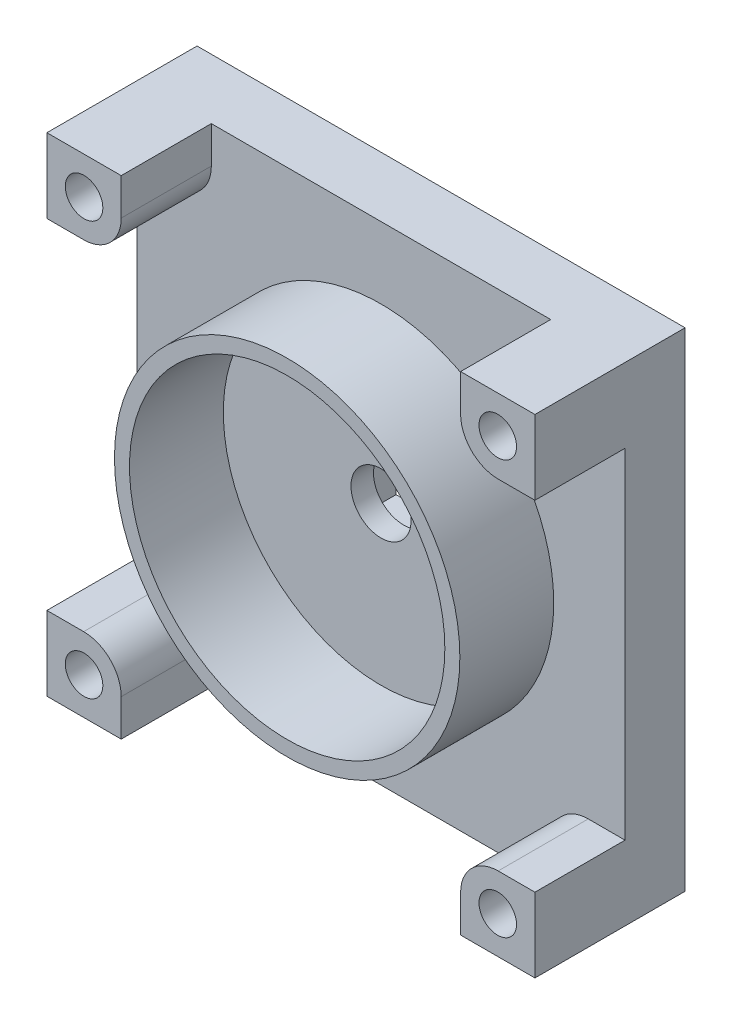
ISO-10303-21;
HEADER;
FILE_DESCRIPTION(('STEP AP214'),'2;1');
FILE_NAME('part.step','',(''),(''),'','','');
FILE_SCHEMA(('AUTOMOTIVE_DESIGN { 1 0 10303 214 1 1 1 1 }'));
ENDSEC;
DATA;
#1=APPLICATION_CONTEXT('core data for automotive mechanical design processes');
#2=APPLICATION_PROTOCOL_DEFINITION('international standard','automotive_design',2000,#1);
#3=PRODUCT_CONTEXT('',#1,'mechanical');
#4=PRODUCT('Part','Part','',(#3));
#5=PRODUCT_RELATED_PRODUCT_CATEGORY('part','',(#4));
#6=PRODUCT_DEFINITION_FORMATION('','',#4);
#7=PRODUCT_DEFINITION_CONTEXT('part definition',#1,'design');
#8=PRODUCT_DEFINITION('design','',#6,#7);
#9=PRODUCT_DEFINITION_SHAPE('','',#8);
#10=(LENGTH_UNIT() NAMED_UNIT(*) SI_UNIT(.MILLI.,.METRE.));
#11=(NAMED_UNIT(*) PLANE_ANGLE_UNIT() SI_UNIT($,.RADIAN.));
#12=(NAMED_UNIT(*) SI_UNIT($,.STERADIAN.) SOLID_ANGLE_UNIT());
#13=UNCERTAINTY_MEASURE_WITH_UNIT(LENGTH_MEASURE(1.E-05),#10,'distance_accuracy_value','');
#14=(GEOMETRIC_REPRESENTATION_CONTEXT(3) GLOBAL_UNCERTAINTY_ASSIGNED_CONTEXT((#13)) GLOBAL_UNIT_ASSIGNED_CONTEXT((#10,
#11,#12)) REPRESENTATION_CONTEXT('',''));
#15=CARTESIAN_POINT('',(0.,0.,0.));
#16=DIRECTION('',(0.,0.,1.));
#17=DIRECTION('',(1.,0.,0.));
#18=AXIS2_PLACEMENT_3D('',#15,#16,#17);
#19=CARTESIAN_POINT('',(0.,0.,0.));
#20=DIRECTION('',(0.,0.,-1.));
#21=DIRECTION('',(-1.,0.,0.));
#22=AXIS2_PLACEMENT_3D('',#19,#20,#21);
#23=PLANE('',#22);
#24=CARTESIAN_POINT('',(0.,0.,0.));
#25=DIRECTION('',(0.,0.,1.));
#26=DIRECTION('',(1.,0.,0.));
#27=AXIS2_PLACEMENT_3D('',#24,#25,#26);
#28=CIRCLE('',#27,23.);
#29=CARTESIAN_POINT('',(23.,0.,0.));
#30=VERTEX_POINT('',#29);
#31=EDGE_CURVE('E43',#30,#30,#28,.T.);
#32=ORIENTED_EDGE('',*,*,#31,.F.);
#33=EDGE_LOOP('',(#32));
#34=FACE_BOUND('',#33,.T.);
#35=DIRECTION('',(-1.,0.,0.));
#36=VECTOR('',#35,1.);
#37=CARTESIAN_POINT('',(27.6005050633884,-22.6005050633883,0.));
#38=LINE('',#37,#36);
#39=CARTESIAN_POINT('',(32.5,-22.6005050633883,0.));
#40=VERTEX_POINT('',#39);
#41=CARTESIAN_POINT('',(27.6005050633884,-22.6005050633883,0.));
#42=VERTEX_POINT('',#41);
#43=EDGE_CURVE('E424',#40,#42,#38,.T.);
#44=ORIENTED_EDGE('',*,*,#43,.F.);
#45=DIRECTION('',(0.,1.,0.));
#46=VECTOR('',#45,1.);
#47=CARTESIAN_POINT('',(32.5,-32.5,0.));
#48=LINE('',#47,#46);
#49=CARTESIAN_POINT('',(32.5,22.6005050633883,0.));
#50=VERTEX_POINT('',#49);
#51=EDGE_CURVE('E222',#40,#50,#48,.T.);
#52=ORIENTED_EDGE('',*,*,#51,.T.);
#53=DIRECTION('',(1.,0.,0.));
#54=VECTOR('',#53,1.);
#55=CARTESIAN_POINT('',(27.6005050633884,22.6005050633883,0.));
#56=LINE('',#55,#54);
#57=CARTESIAN_POINT('',(27.6005050633884,22.6005050633883,0.));
#58=VERTEX_POINT('',#57);
#59=EDGE_CURVE('E307',#58,#50,#56,.T.);
#60=ORIENTED_EDGE('',*,*,#59,.F.);
#61=CARTESIAN_POINT('',(27.6005050633883,27.6005050633883,0.));
#62=DIRECTION('',(0.,0.,1.));
#63=DIRECTION('',(-1.,0.,0.));
#64=AXIS2_PLACEMENT_3D('',#61,#62,#63);
#65=CIRCLE('',#64,5.);
#66=CARTESIAN_POINT('',(22.6005050633883,27.6005050633883,0.));
#67=VERTEX_POINT('',#66);
#68=EDGE_CURVE('E318',#67,#58,#65,.T.);
#69=ORIENTED_EDGE('',*,*,#68,.F.);
#70=DIRECTION('',(0.,-1.,0.));
#71=VECTOR('',#70,1.);
#72=CARTESIAN_POINT('',(22.6005050633883,27.6005050633884,0.));
#73=LINE('',#72,#71);
#74=CARTESIAN_POINT('',(22.6005050633883,32.5,0.));
#75=VERTEX_POINT('',#74);
#76=EDGE_CURVE('E302',#75,#67,#73,.T.);
#77=ORIENTED_EDGE('',*,*,#76,.F.);
#78=DIRECTION('',(-1.,0.,0.));
#79=VECTOR('',#78,1.);
#80=CARTESIAN_POINT('',(-32.5,32.5,0.));
#81=LINE('',#80,#79);
#82=CARTESIAN_POINT('',(-22.6005050633883,32.5,0.));
#83=VERTEX_POINT('',#82);
#84=EDGE_CURVE('E398',#75,#83,#81,.T.);
#85=ORIENTED_EDGE('',*,*,#84,.T.);
#86=DIRECTION('',(0.,1.,0.));
#87=VECTOR('',#86,1.);
#88=CARTESIAN_POINT('',(-22.6005050633883,27.6005050633884,0.));
#89=LINE('',#88,#87);
#90=CARTESIAN_POINT('',(-22.6005050633883,27.6005050633884,0.));
#91=VERTEX_POINT('',#90);
#92=EDGE_CURVE('E271',#91,#83,#89,.T.);
#93=ORIENTED_EDGE('',*,*,#92,.F.);
#94=CARTESIAN_POINT('',(-27.6005050633883,27.6005050633883,0.));
#95=DIRECTION('',(0.,0.,1.));
#96=DIRECTION('',(1.,0.,0.));
#97=AXIS2_PLACEMENT_3D('',#94,#95,#96);
#98=CIRCLE('',#97,5.);
#99=CARTESIAN_POINT('',(-27.6005050633884,22.6005050633883,0.));
#100=VERTEX_POINT('',#99);
#101=EDGE_CURVE('E283',#100,#91,#98,.T.);
#102=ORIENTED_EDGE('',*,*,#101,.F.);
#103=DIRECTION('',(1.,0.,0.));
#104=VECTOR('',#103,1.);
#105=CARTESIAN_POINT('',(-27.6005050633884,22.6005050633883,0.));
#106=LINE('',#105,#104);
#107=CARTESIAN_POINT('',(-32.5,22.6005050633883,0.));
#108=VERTEX_POINT('',#107);
#109=EDGE_CURVE('E266',#108,#100,#106,.T.);
#110=ORIENTED_EDGE('',*,*,#109,.F.);
#111=DIRECTION('',(0.,-1.,0.));
#112=VECTOR('',#111,1.);
#113=CARTESIAN_POINT('',(-32.5,-32.5,0.));
#114=LINE('',#113,#112);
#115=CARTESIAN_POINT('',(-32.5,-22.6005050633883,0.));
#116=VERTEX_POINT('',#115);
#117=EDGE_CURVE('E400',#108,#116,#114,.T.);
#118=ORIENTED_EDGE('',*,*,#117,.T.);
#119=DIRECTION('',(-1.,0.,0.));
#120=VECTOR('',#119,1.);
#121=CARTESIAN_POINT('',(-27.6005050633884,-22.6005050633883,0.));
#122=LINE('',#121,#120);
#123=CARTESIAN_POINT('',(-27.6005050633884,-22.6005050633883,0.));
#124=VERTEX_POINT('',#123);
#125=EDGE_CURVE('E236',#124,#116,#122,.T.);
#126=ORIENTED_EDGE('',*,*,#125,.F.);
#127=CARTESIAN_POINT('',(-27.6005050633883,-27.6005050633883,0.));
#128=DIRECTION('',(0.,0.,1.));
#129=DIRECTION('',(-1.,0.,0.));
#130=AXIS2_PLACEMENT_3D('',#127,#128,#129);
#131=CIRCLE('',#130,5.);
#132=CARTESIAN_POINT('',(-22.6005050633883,-27.6005050633884,0.));
#133=VERTEX_POINT('',#132);
#134=EDGE_CURVE('E247',#133,#124,#131,.T.);
#135=ORIENTED_EDGE('',*,*,#134,.F.);
#136=DIRECTION('',(0.,1.,0.));
#137=VECTOR('',#136,1.);
#138=CARTESIAN_POINT('',(-22.6005050633883,-27.6005050633884,0.));
#139=LINE('',#138,#137);
#140=CARTESIAN_POINT('',(-22.6005050633883,-32.5,0.));
#141=VERTEX_POINT('',#140);
#142=EDGE_CURVE('E226',#141,#133,#139,.T.);
#143=ORIENTED_EDGE('',*,*,#142,.F.);
#144=DIRECTION('',(1.,0.,0.));
#145=VECTOR('',#144,1.);
#146=CARTESIAN_POINT('',(-32.5,-32.5,0.));
#147=LINE('',#146,#145);
#148=CARTESIAN_POINT('',(22.6005050633883,-32.5,0.));
#149=VERTEX_POINT('',#148);
#150=EDGE_CURVE('E387',#141,#149,#147,.T.);
#151=ORIENTED_EDGE('',*,*,#150,.T.);
#152=DIRECTION('',(0.,-1.,0.));
#153=VECTOR('',#152,1.);
#154=CARTESIAN_POINT('',(22.6005050633883,-27.6005050633884,0.));
#155=LINE('',#154,#153);
#156=CARTESIAN_POINT('',(22.6005050633883,-27.6005050633884,0.));
#157=VERTEX_POINT('',#156);
#158=EDGE_CURVE('E60',#157,#149,#155,.T.);
#159=ORIENTED_EDGE('',*,*,#158,.F.);
#160=CARTESIAN_POINT('',(27.6005050633883,-27.6005050633883,0.));
#161=DIRECTION('',(0.,0.,1.));
#162=DIRECTION('',(1.,0.,0.));
#163=AXIS2_PLACEMENT_3D('',#160,#161,#162);
#164=CIRCLE('',#163,5.);
#165=EDGE_CURVE('E55',#42,#157,#164,.T.);
#166=ORIENTED_EDGE('',*,*,#165,.F.);
#167=EDGE_LOOP('',(#44,#52,#60,#69,#77,#85,#93,#102,#110,#118,#126,#135,#143,#151,#159,#166));
#168=FACE_BOUND('',#167,.T.);
#169=ADVANCED_FACE('F39',(#34,#168),#23,.F.);
#170=CARTESIAN_POINT('',(0.,0.,12.5));
#171=DIRECTION('',(0.,0.,1.));
#172=DIRECTION('',(1.,0.,0.));
#173=AXIS2_PLACEMENT_3D('',#170,#171,#172);
#174=PLANE('',#173);
#175=CARTESIAN_POINT('',(0.,0.,12.5));
#176=DIRECTION('',(0.,0.,1.));
#177=DIRECTION('',(1.,0.,0.));
#178=AXIS2_PLACEMENT_3D('',#175,#176,#177);
#179=CIRCLE('',#178,23.);
#180=CARTESIAN_POINT('',(23.,0.,12.5));
#181=VERTEX_POINT('',#180);
#182=EDGE_CURVE('E11',#181,#181,#179,.T.);
#183=ORIENTED_EDGE('',*,*,#182,.T.);
#184=EDGE_LOOP('',(#183));
#185=FACE_BOUND('',#184,.T.);
#186=CARTESIAN_POINT('',(0.,0.,12.5));
#187=DIRECTION('',(0.,0.,1.));
#188=DIRECTION('',(1.,0.,0.));
#189=AXIS2_PLACEMENT_3D('',#186,#187,#188);
#190=CIRCLE('',#189,21.);
#191=CARTESIAN_POINT('',(21.,0.,12.5));
#192=VERTEX_POINT('',#191);
#193=EDGE_CURVE('E48',#192,#192,#190,.T.);
#194=ORIENTED_EDGE('',*,*,#193,.F.);
#195=EDGE_LOOP('',(#194));
#196=FACE_BOUND('',#195,.T.);
#197=ADVANCED_FACE('F421',(#185,#196),#174,.T.);
#198=CARTESIAN_POINT('',(0.,0.,12.5));
#199=DIRECTION('',(0.,0.,-1.));
#200=DIRECTION('',(-1.,0.,0.));
#201=AXIS2_PLACEMENT_3D('',#198,#199,#200);
#202=CYLINDRICAL_SURFACE('',#201,23.);
#203=ORIENTED_EDGE('',*,*,#182,.F.);
#204=EDGE_LOOP('',(#203));
#205=FACE_BOUND('',#204,.T.);
#206=ORIENTED_EDGE('',*,*,#31,.T.);
#207=EDGE_LOOP('',(#206));
#208=FACE_BOUND('',#207,.T.);
#209=ADVANCED_FACE('F41',(#205,#208),#202,.T.);
#210=CARTESIAN_POINT('',(0.,0.,12.5));
#211=DIRECTION('',(0.,0.,-1.));
#212=DIRECTION('',(-1.,0.,0.));
#213=AXIS2_PLACEMENT_3D('',#210,#211,#212);
#214=CYLINDRICAL_SURFACE('',#213,21.);
#215=ORIENTED_EDGE('',*,*,#193,.T.);
#216=EDGE_LOOP('',(#215));
#217=FACE_BOUND('',#216,.T.);
#218=CARTESIAN_POINT('',(0.,0.,0.));
#219=DIRECTION('',(0.,0.,1.));
#220=DIRECTION('',(1.,0.,0.));
#221=AXIS2_PLACEMENT_3D('',#218,#219,#220);
#222=CIRCLE('',#221,21.);
#223=CARTESIAN_POINT('',(21.,0.,0.));
#224=VERTEX_POINT('',#223);
#225=EDGE_CURVE('E412',#224,#224,#222,.T.);
#226=ORIENTED_EDGE('',*,*,#225,.F.);
#227=EDGE_LOOP('',(#226));
#228=FACE_BOUND('',#227,.T.);
#229=ADVANCED_FACE('F548',(#217,#228),#214,.F.);
#230=CARTESIAN_POINT('',(0.,0.,0.));
#231=DIRECTION('',(0.,0.,-1.));
#232=DIRECTION('',(-1.,0.,0.));
#233=AXIS2_PLACEMENT_3D('',#230,#231,#232);
#234=CIRCLE('',#233,4.);
#235=CARTESIAN_POINT('',(-4.,0.,0.));
#236=VERTEX_POINT('',#235);
#237=EDGE_CURVE('E336',#236,#236,#234,.F.);
#238=ORIENTED_EDGE('',*,*,#237,.F.);
#239=EDGE_LOOP('',(#238));
#240=FACE_BOUND('',#239,.T.);
#241=ORIENTED_EDGE('',*,*,#225,.T.);
#242=EDGE_LOOP('',(#241));
#243=FACE_BOUND('',#242,.T.);
#244=ADVANCED_FACE('F423',(#240,#243),#23,.F.);
#245=CARTESIAN_POINT('',(32.5,-32.5,-8.));
#246=DIRECTION('',(1.,0.,0.));
#247=DIRECTION('',(0.,0.,-1.));
#248=AXIS2_PLACEMENT_3D('',#245,#246,#247);
#249=PLANE('',#248);
#250=ORIENTED_EDGE('',*,*,#51,.F.);
#251=DIRECTION('',(0.,0.,-1.));
#252=VECTOR('',#251,1.);
#253=CARTESIAN_POINT('',(32.5,-22.6005050633883,12.));
#254=LINE('',#253,#252);
#255=CARTESIAN_POINT('',(32.5,-22.6005050633883,12.));
#256=VERTEX_POINT('',#255);
#257=EDGE_CURVE('E203',#256,#40,#254,.T.);
#258=ORIENTED_EDGE('',*,*,#257,.F.);
#259=DIRECTION('',(0.,1.,0.));
#260=VECTOR('',#259,1.);
#261=CARTESIAN_POINT('',(32.5,-22.6005050633883,12.));
#262=LINE('',#261,#260);
#263=CARTESIAN_POINT('',(32.5,-32.5,12.));
#264=VERTEX_POINT('',#263);
#265=EDGE_CURVE('E209',#264,#256,#262,.T.);
#266=ORIENTED_EDGE('',*,*,#265,.F.);
#267=DIRECTION('',(0.,0.,1.));
#268=VECTOR('',#267,1.);
#269=CARTESIAN_POINT('',(32.5,-32.5,-8.));
#270=LINE('',#269,#268);
#271=CARTESIAN_POINT('',(32.5,-32.5,-8.));
#272=VERTEX_POINT('',#271);
#273=EDGE_CURVE('E403',#272,#264,#270,.T.);
#274=ORIENTED_EDGE('',*,*,#273,.F.);
#275=DIRECTION('',(0.,1.,0.));
#276=VECTOR('',#275,1.);
#277=CARTESIAN_POINT('',(32.5,-32.5,-8.));
#278=LINE('',#277,#276);
#279=CARTESIAN_POINT('',(32.5,32.5,-8.));
#280=VERTEX_POINT('',#279);
#281=EDGE_CURVE('E383',#272,#280,#278,.T.);
#282=ORIENTED_EDGE('',*,*,#281,.T.);
#283=DIRECTION('',(0.,0.,1.));
#284=VECTOR('',#283,1.);
#285=CARTESIAN_POINT('',(32.5,32.5,-8.));
#286=LINE('',#285,#284);
#287=CARTESIAN_POINT('',(32.5,32.5,12.));
#288=VERTEX_POINT('',#287);
#289=EDGE_CURVE('E396',#280,#288,#286,.T.);
#290=ORIENTED_EDGE('',*,*,#289,.T.);
#291=DIRECTION('',(0.,1.,0.));
#292=VECTOR('',#291,1.);
#293=CARTESIAN_POINT('',(32.5,22.6005050633883,12.));
#294=LINE('',#293,#292);
#295=CARTESIAN_POINT('',(32.5,22.6005050633883,12.));
#296=VERTEX_POINT('',#295);
#297=EDGE_CURVE('E303',#296,#288,#294,.T.);
#298=ORIENTED_EDGE('',*,*,#297,.F.);
#299=DIRECTION('',(0.,0.,-1.));
#300=VECTOR('',#299,1.);
#301=CARTESIAN_POINT('',(32.5,22.6005050633883,12.));
#302=LINE('',#301,#300);
#303=EDGE_CURVE('E315',#296,#50,#302,.T.);
#304=ORIENTED_EDGE('',*,*,#303,.T.);
#305=EDGE_LOOP('',(#250,#258,#266,#274,#282,#290,#298,#304));
#306=FACE_BOUND('',#305,.T.);
#307=ADVANCED_FACE('F220',(#306),#249,.T.);
#308=CARTESIAN_POINT('',(-32.5,-32.5,-8.));
#309=DIRECTION('',(0.,-1.,0.));
#310=DIRECTION('',(0.,0.,-1.));
#311=AXIS2_PLACEMENT_3D('',#308,#309,#310);
#312=PLANE('',#311);
#313=ORIENTED_EDGE('',*,*,#150,.F.);
#314=DIRECTION('',(0.,0.,-1.));
#315=VECTOR('',#314,1.);
#316=CARTESIAN_POINT('',(-22.6005050633883,-32.5,12.));
#317=LINE('',#316,#315);
#318=CARTESIAN_POINT('',(-22.6005050633883,-32.5,12.));
#319=VERTEX_POINT('',#318);
#320=EDGE_CURVE('E260',#319,#141,#317,.T.);
#321=ORIENTED_EDGE('',*,*,#320,.F.);
#322=DIRECTION('',(1.,0.,0.));
#323=VECTOR('',#322,1.);
#324=CARTESIAN_POINT('',(-22.6005050633883,-32.5,12.));
#325=LINE('',#324,#323);
#326=CARTESIAN_POINT('',(-32.5,-32.5,12.));
#327=VERTEX_POINT('',#326);
#328=EDGE_CURVE('E235',#327,#319,#325,.T.);
#329=ORIENTED_EDGE('',*,*,#328,.F.);
#330=DIRECTION('',(0.,0.,1.));
#331=VECTOR('',#330,1.);
#332=CARTESIAN_POINT('',(-32.5,-32.5,-8.));
#333=LINE('',#332,#331);
#334=CARTESIAN_POINT('',(-32.5,-32.5,-8.));
#335=VERTEX_POINT('',#334);
#336=EDGE_CURVE('E405',#335,#327,#333,.T.);
#337=ORIENTED_EDGE('',*,*,#336,.F.);
#338=DIRECTION('',(1.,0.,0.));
#339=VECTOR('',#338,1.);
#340=CARTESIAN_POINT('',(-32.5,-32.5,-8.));
#341=LINE('',#340,#339);
#342=EDGE_CURVE('E393',#335,#272,#341,.T.);
#343=ORIENTED_EDGE('',*,*,#342,.T.);
#344=ORIENTED_EDGE('',*,*,#273,.T.);
#345=DIRECTION('',(1.,0.,0.));
#346=VECTOR('',#345,1.);
#347=CARTESIAN_POINT('',(22.6005050633883,-32.5,12.));
#348=LINE('',#347,#346);
#349=CARTESIAN_POINT('',(22.6005050633883,-32.5,12.));
#350=VERTEX_POINT('',#349);
#351=EDGE_CURVE('E216',#350,#264,#348,.T.);
#352=ORIENTED_EDGE('',*,*,#351,.F.);
#353=DIRECTION('',(0.,0.,-1.));
#354=VECTOR('',#353,1.);
#355=CARTESIAN_POINT('',(22.6005050633883,-32.5,12.));
#356=LINE('',#355,#354);
#357=EDGE_CURVE('E434',#350,#149,#356,.T.);
#358=ORIENTED_EDGE('',*,*,#357,.T.);
#359=EDGE_LOOP('',(#313,#321,#329,#337,#343,#344,#352,#358));
#360=FACE_BOUND('',#359,.T.);
#361=ADVANCED_FACE('F448',(#360),#312,.T.);
#362=CARTESIAN_POINT('',(-32.5,-32.5,-8.));
#363=DIRECTION('',(-1.,0.,0.));
#364=DIRECTION('',(0.,0.,1.));
#365=AXIS2_PLACEMENT_3D('',#362,#363,#364);
#366=PLANE('',#365);
#367=ORIENTED_EDGE('',*,*,#117,.F.);
#368=DIRECTION('',(0.,0.,-1.));
#369=VECTOR('',#368,1.);
#370=CARTESIAN_POINT('',(-32.5,22.6005050633883,12.));
#371=LINE('',#370,#369);
#372=CARTESIAN_POINT('',(-32.5,22.6005050633883,12.));
#373=VERTEX_POINT('',#372);
#374=EDGE_CURVE('E296',#373,#108,#371,.T.);
#375=ORIENTED_EDGE('',*,*,#374,.F.);
#376=DIRECTION('',(0.,-1.,0.));
#377=VECTOR('',#376,1.);
#378=CARTESIAN_POINT('',(-32.5,22.6005050633883,12.));
#379=LINE('',#378,#377);
#380=CARTESIAN_POINT('',(-32.5,32.5,12.));
#381=VERTEX_POINT('',#380);
#382=EDGE_CURVE('E267',#381,#373,#379,.T.);
#383=ORIENTED_EDGE('',*,*,#382,.F.);
#384=DIRECTION('',(0.,0.,1.));
#385=VECTOR('',#384,1.);
#386=CARTESIAN_POINT('',(-32.5,32.5,-8.));
#387=LINE('',#386,#385);
#388=CARTESIAN_POINT('',(-32.5,32.5,-8.));
#389=VERTEX_POINT('',#388);
#390=EDGE_CURVE('E407',#389,#381,#387,.T.);
#391=ORIENTED_EDGE('',*,*,#390,.F.);
#392=DIRECTION('',(0.,-1.,0.));
#393=VECTOR('',#392,1.);
#394=CARTESIAN_POINT('',(-32.5,-32.5,-8.));
#395=LINE('',#394,#393);
#396=EDGE_CURVE('E390',#389,#335,#395,.T.);
#397=ORIENTED_EDGE('',*,*,#396,.T.);
#398=ORIENTED_EDGE('',*,*,#336,.T.);
#399=DIRECTION('',(0.,-1.,0.));
#400=VECTOR('',#399,1.);
#401=CARTESIAN_POINT('',(-32.5,-22.6005050633883,12.));
#402=LINE('',#401,#400);
#403=CARTESIAN_POINT('',(-32.5,-22.6005050633883,12.));
#404=VERTEX_POINT('',#403);
#405=EDGE_CURVE('E232',#404,#327,#402,.T.);
#406=ORIENTED_EDGE('',*,*,#405,.F.);
#407=DIRECTION('',(0.,0.,-1.));
#408=VECTOR('',#407,1.);
#409=CARTESIAN_POINT('',(-32.5,-22.6005050633883,12.));
#410=LINE('',#409,#408);
#411=EDGE_CURVE('E244',#404,#116,#410,.T.);
#412=ORIENTED_EDGE('',*,*,#411,.T.);
#413=EDGE_LOOP('',(#367,#375,#383,#391,#397,#398,#406,#412));
#414=FACE_BOUND('',#413,.T.);
#415=ADVANCED_FACE('F491',(#414),#366,.T.);
#416=CARTESIAN_POINT('',(-32.5,32.5,-8.));
#417=DIRECTION('',(0.,1.,0.));
#418=DIRECTION('',(0.,0.,1.));
#419=AXIS2_PLACEMENT_3D('',#416,#417,#418);
#420=PLANE('',#419);
#421=ORIENTED_EDGE('',*,*,#84,.F.);
#422=DIRECTION('',(0.,0.,-1.));
#423=VECTOR('',#422,1.);
#424=CARTESIAN_POINT('',(22.6005050633883,32.5,12.));
#425=LINE('',#424,#423);
#426=CARTESIAN_POINT('',(22.6005050633883,32.5,12.));
#427=VERTEX_POINT('',#426);
#428=EDGE_CURVE('E330',#427,#75,#425,.T.);
#429=ORIENTED_EDGE('',*,*,#428,.F.);
#430=DIRECTION('',(-1.,0.,0.));
#431=VECTOR('',#430,1.);
#432=CARTESIAN_POINT('',(22.6005050633883,32.5,12.));
#433=LINE('',#432,#431);
#434=EDGE_CURVE('E306',#288,#427,#433,.T.);
#435=ORIENTED_EDGE('',*,*,#434,.F.);
#436=ORIENTED_EDGE('',*,*,#289,.F.);
#437=DIRECTION('',(-1.,0.,0.));
#438=VECTOR('',#437,1.);
#439=CARTESIAN_POINT('',(-32.5,32.5,-8.));
#440=LINE('',#439,#438);
#441=EDGE_CURVE('E386',#280,#389,#440,.T.);
#442=ORIENTED_EDGE('',*,*,#441,.T.);
#443=ORIENTED_EDGE('',*,*,#390,.T.);
#444=DIRECTION('',(-1.,0.,0.));
#445=VECTOR('',#444,1.);
#446=CARTESIAN_POINT('',(-22.6005050633883,32.5,12.));
#447=LINE('',#446,#445);
#448=CARTESIAN_POINT('',(-22.6005050633883,32.5,12.));
#449=VERTEX_POINT('',#448);
#450=EDGE_CURVE('E277',#449,#381,#447,.T.);
#451=ORIENTED_EDGE('',*,*,#450,.F.);
#452=DIRECTION('',(0.,0.,-1.));
#453=VECTOR('',#452,1.);
#454=CARTESIAN_POINT('',(-22.6005050633883,32.5,12.));
#455=LINE('',#454,#453);
#456=EDGE_CURVE('E280',#449,#83,#455,.T.);
#457=ORIENTED_EDGE('',*,*,#456,.T.);
#458=EDGE_LOOP('',(#421,#429,#435,#436,#442,#443,#451,#457));
#459=FACE_BOUND('',#458,.T.);
#460=ADVANCED_FACE('F457',(#459),#420,.T.);
#461=CARTESIAN_POINT('',(0.,0.,-8.));
#462=DIRECTION('',(0.,0.,-1.));
#463=DIRECTION('',(-1.,0.,0.));
#464=AXIS2_PLACEMENT_3D('',#461,#462,#463);
#465=PLANE('',#464);
#466=DIRECTION('',(0.,1.,0.));
#467=VECTOR('',#466,1.);
#468=CARTESIAN_POINT('',(-6.,-6.,-8.));
#469=LINE('',#468,#467);
#470=CARTESIAN_POINT('',(-6.,-6.,-8.));
#471=VERTEX_POINT('',#470);
#472=CARTESIAN_POINT('',(-6.,6.,-8.));
#473=VERTEX_POINT('',#472);
#474=EDGE_CURVE('E339',#471,#473,#469,.T.);
#475=ORIENTED_EDGE('',*,*,#474,.F.);
#476=DIRECTION('',(-1.,0.,0.));
#477=VECTOR('',#476,1.);
#478=CARTESIAN_POINT('',(6.,-6.,-8.));
#479=LINE('',#478,#477);
#480=CARTESIAN_POINT('',(6.,-6.,-8.));
#481=VERTEX_POINT('',#480);
#482=EDGE_CURVE('E344',#481,#471,#479,.T.);
#483=ORIENTED_EDGE('',*,*,#482,.F.);
#484=DIRECTION('',(0.,-1.,0.));
#485=VECTOR('',#484,1.);
#486=CARTESIAN_POINT('',(6.,-6.,-8.));
#487=LINE('',#486,#485);
#488=CARTESIAN_POINT('',(6.,6.,-8.));
#489=VERTEX_POINT('',#488);
#490=EDGE_CURVE('E358',#489,#481,#487,.T.);
#491=ORIENTED_EDGE('',*,*,#490,.F.);
#492=DIRECTION('',(1.,0.,0.));
#493=VECTOR('',#492,1.);
#494=CARTESIAN_POINT('',(6.,6.,-8.));
#495=LINE('',#494,#493);
#496=EDGE_CURVE('E355',#473,#489,#495,.T.);
#497=ORIENTED_EDGE('',*,*,#496,.F.);
#498=EDGE_LOOP('',(#475,#483,#491,#497));
#499=FACE_BOUND('',#498,.T.);
#500=CARTESIAN_POINT('',(27.5502525316942,-27.5502525316942,-8.));
#501=DIRECTION('',(0.,0.,1.));
#502=DIRECTION('',(1.,0.,0.));
#503=AXIS2_PLACEMENT_3D('',#500,#501,#502);
#504=CIRCLE('',#503,2.5);
#505=CARTESIAN_POINT('',(30.0502525316942,-27.5502525316942,-8.));
#506=VERTEX_POINT('',#505);
#507=EDGE_CURVE('E365',#506,#506,#504,.T.);
#508=ORIENTED_EDGE('',*,*,#507,.T.);
#509=EDGE_LOOP('',(#508));
#510=FACE_BOUND('',#509,.T.);
#511=CARTESIAN_POINT('',(-27.5502525316942,-27.5502525316942,-8.));
#512=DIRECTION('',(0.,0.,1.));
#513=DIRECTION('',(1.,0.,0.));
#514=AXIS2_PLACEMENT_3D('',#511,#512,#513);
#515=CIRCLE('',#514,2.5);
#516=CARTESIAN_POINT('',(-25.0502525316942,-27.5502525316942,-8.));
#517=VERTEX_POINT('',#516);
#518=EDGE_CURVE('E374',#517,#517,#515,.T.);
#519=ORIENTED_EDGE('',*,*,#518,.T.);
#520=EDGE_LOOP('',(#519));
#521=FACE_BOUND('',#520,.T.);
#522=CARTESIAN_POINT('',(27.5502525316942,27.5502525316942,-8.));
#523=DIRECTION('',(0.,0.,1.));
#524=DIRECTION('',(1.,0.,0.));
#525=AXIS2_PLACEMENT_3D('',#522,#523,#524);
#526=CIRCLE('',#525,2.5);
#527=CARTESIAN_POINT('',(30.0502525316942,27.5502525316942,-8.));
#528=VERTEX_POINT('',#527);
#529=EDGE_CURVE('E377',#528,#528,#526,.T.);
#530=ORIENTED_EDGE('',*,*,#529,.T.);
#531=EDGE_LOOP('',(#530));
#532=FACE_BOUND('',#531,.T.);
#533=CARTESIAN_POINT('',(-27.5502525316942,27.5502525316942,-8.));
#534=DIRECTION('',(0.,0.,1.));
#535=DIRECTION('',(1.,0.,0.));
#536=AXIS2_PLACEMENT_3D('',#533,#534,#535);
#537=CIRCLE('',#536,2.5);
#538=CARTESIAN_POINT('',(-25.0502525316942,27.5502525316942,-8.));
#539=VERTEX_POINT('',#538);
#540=EDGE_CURVE('E380',#539,#539,#537,.T.);
#541=ORIENTED_EDGE('',*,*,#540,.T.);
#542=EDGE_LOOP('',(#541));
#543=FACE_BOUND('',#542,.T.);
#544=ORIENTED_EDGE('',*,*,#281,.F.);
#545=ORIENTED_EDGE('',*,*,#342,.F.);
#546=ORIENTED_EDGE('',*,*,#396,.F.);
#547=ORIENTED_EDGE('',*,*,#441,.F.);
#548=EDGE_LOOP('',(#544,#545,#546,#547));
#549=FACE_BOUND('',#548,.T.);
#550=ADVANCED_FACE('F453',(#499,#510,#521,#532,#543,#549),#465,.T.);
#551=CARTESIAN_POINT('',(-27.5502525316942,27.5502525316942,-8.));
#552=DIRECTION('',(0.,0.,1.));
#553=DIRECTION('',(1.,0.,0.));
#554=AXIS2_PLACEMENT_3D('',#551,#552,#553);
#555=CYLINDRICAL_SURFACE('',#554,2.5);
#556=ORIENTED_EDGE('',*,*,#540,.F.);
#557=EDGE_LOOP('',(#556));
#558=FACE_BOUND('',#557,.T.);
#559=CARTESIAN_POINT('',(-27.5502525316942,27.5502525316942,12.));
#560=DIRECTION('',(0.,0.,1.));
#561=DIRECTION('',(1.,0.,0.));
#562=AXIS2_PLACEMENT_3D('',#559,#560,#561);
#563=CIRCLE('',#562,2.5);
#564=CARTESIAN_POINT('',(-25.0502525316942,27.5502525316942,12.));
#565=VERTEX_POINT('',#564);
#566=EDGE_CURVE('E263',#565,#565,#563,.T.);
#567=ORIENTED_EDGE('',*,*,#566,.T.);
#568=EDGE_LOOP('',(#567));
#569=FACE_BOUND('',#568,.T.);
#570=ADVANCED_FACE('F528',(#558,#569),#555,.F.);
#571=CARTESIAN_POINT('',(27.5502525316942,27.5502525316942,-8.));
#572=DIRECTION('',(0.,0.,1.));
#573=DIRECTION('',(1.,0.,0.));
#574=AXIS2_PLACEMENT_3D('',#571,#572,#573);
#575=CYLINDRICAL_SURFACE('',#574,2.5);
#576=ORIENTED_EDGE('',*,*,#529,.F.);
#577=EDGE_LOOP('',(#576));
#578=FACE_BOUND('',#577,.T.);
#579=CARTESIAN_POINT('',(27.5502525316942,27.5502525316942,12.));
#580=DIRECTION('',(0.,0.,1.));
#581=DIRECTION('',(1.,0.,0.));
#582=AXIS2_PLACEMENT_3D('',#579,#580,#581);
#583=CIRCLE('',#582,2.5);
#584=CARTESIAN_POINT('',(30.0502525316942,27.5502525316942,12.));
#585=VERTEX_POINT('',#584);
#586=EDGE_CURVE('E299',#585,#585,#583,.T.);
#587=ORIENTED_EDGE('',*,*,#586,.T.);
#588=EDGE_LOOP('',(#587));
#589=FACE_BOUND('',#588,.T.);
#590=ADVANCED_FACE('F518',(#578,#589),#575,.F.);
#591=CARTESIAN_POINT('',(-27.5502525316942,-27.5502525316942,-8.));
#592=DIRECTION('',(0.,0.,1.));
#593=DIRECTION('',(1.,0.,0.));
#594=AXIS2_PLACEMENT_3D('',#591,#592,#593);
#595=CYLINDRICAL_SURFACE('',#594,2.5);
#596=ORIENTED_EDGE('',*,*,#518,.F.);
#597=EDGE_LOOP('',(#596));
#598=FACE_BOUND('',#597,.T.);
#599=CARTESIAN_POINT('',(-27.5502525316942,-27.5502525316942,12.));
#600=DIRECTION('',(0.,0.,1.));
#601=DIRECTION('',(1.,0.,0.));
#602=AXIS2_PLACEMENT_3D('',#599,#600,#601);
#603=CIRCLE('',#602,2.5);
#604=CARTESIAN_POINT('',(-25.0502525316942,-27.5502525316942,12.));
#605=VERTEX_POINT('',#604);
#606=EDGE_CURVE('E223',#605,#605,#603,.T.);
#607=ORIENTED_EDGE('',*,*,#606,.T.);
#608=EDGE_LOOP('',(#607));
#609=FACE_BOUND('',#608,.T.);
#610=ADVANCED_FACE('F515',(#598,#609),#595,.F.);
#611=CARTESIAN_POINT('',(27.5502525316942,-27.5502525316942,-8.));
#612=DIRECTION('',(0.,0.,1.));
#613=DIRECTION('',(1.,0.,0.));
#614=AXIS2_PLACEMENT_3D('',#611,#612,#613);
#615=CYLINDRICAL_SURFACE('',#614,2.5);
#616=ORIENTED_EDGE('',*,*,#507,.F.);
#617=EDGE_LOOP('',(#616));
#618=FACE_BOUND('',#617,.T.);
#619=CARTESIAN_POINT('',(27.5502525316942,-27.5502525316942,12.));
#620=DIRECTION('',(0.,0.,1.));
#621=DIRECTION('',(1.,0.,0.));
#622=AXIS2_PLACEMENT_3D('',#619,#620,#621);
#623=CIRCLE('',#622,2.5);
#624=CARTESIAN_POINT('',(30.0502525316942,-27.5502525316942,12.));
#625=VERTEX_POINT('',#624);
#626=EDGE_CURVE('E425',#625,#625,#623,.T.);
#627=ORIENTED_EDGE('',*,*,#626,.T.);
#628=EDGE_LOOP('',(#627));
#629=FACE_BOUND('',#628,.T.);
#630=ADVANCED_FACE('F517',(#618,#629),#615,.F.);
#631=CARTESIAN_POINT('',(-6.,-6.,-3.));
#632=DIRECTION('',(-1.,0.,0.));
#633=DIRECTION('',(0.,0.,1.));
#634=AXIS2_PLACEMENT_3D('',#631,#632,#633);
#635=PLANE('',#634);
#636=ORIENTED_EDGE('',*,*,#474,.T.);
#637=DIRECTION('',(0.,0.,-1.));
#638=VECTOR('',#637,1.);
#639=CARTESIAN_POINT('',(-6.,6.,-3.));
#640=LINE('',#639,#638);
#641=CARTESIAN_POINT('',(-6.,6.,-3.));
#642=VERTEX_POINT('',#641);
#643=EDGE_CURVE('E353',#642,#473,#640,.T.);
#644=ORIENTED_EDGE('',*,*,#643,.F.);
#645=DIRECTION('',(0.,1.,0.));
#646=VECTOR('',#645,1.);
#647=CARTESIAN_POINT('',(-6.,-6.,-3.));
#648=LINE('',#647,#646);
#649=CARTESIAN_POINT('',(-6.,-6.,-3.));
#650=VERTEX_POINT('',#649);
#651=EDGE_CURVE('E340',#650,#642,#648,.T.);
#652=ORIENTED_EDGE('',*,*,#651,.F.);
#653=DIRECTION('',(0.,0.,-1.));
#654=VECTOR('',#653,1.);
#655=CARTESIAN_POINT('',(-6.,-6.,-3.));
#656=LINE('',#655,#654);
#657=EDGE_CURVE('E363',#650,#471,#656,.T.);
#658=ORIENTED_EDGE('',*,*,#657,.T.);
#659=EDGE_LOOP('',(#636,#644,#652,#658));
#660=FACE_BOUND('',#659,.T.);
#661=ADVANCED_FACE('F525',(#660),#635,.F.);
#662=CARTESIAN_POINT('',(6.,-6.,-3.));
#663=DIRECTION('',(0.,-1.,0.));
#664=DIRECTION('',(0.,0.,-1.));
#665=AXIS2_PLACEMENT_3D('',#662,#663,#664);
#666=PLANE('',#665);
#667=ORIENTED_EDGE('',*,*,#482,.T.);
#668=ORIENTED_EDGE('',*,*,#657,.F.);
#669=DIRECTION('',(-1.,0.,0.));
#670=VECTOR('',#669,1.);
#671=CARTESIAN_POINT('',(6.,-6.,-3.));
#672=LINE('',#671,#670);
#673=CARTESIAN_POINT('',(6.,-6.,-3.));
#674=VERTEX_POINT('',#673);
#675=EDGE_CURVE('E350',#674,#650,#672,.T.);
#676=ORIENTED_EDGE('',*,*,#675,.F.);
#677=DIRECTION('',(0.,0.,-1.));
#678=VECTOR('',#677,1.);
#679=CARTESIAN_POINT('',(6.,-6.,-3.));
#680=LINE('',#679,#678);
#681=EDGE_CURVE('E366',#674,#481,#680,.T.);
#682=ORIENTED_EDGE('',*,*,#681,.T.);
#683=EDGE_LOOP('',(#667,#668,#676,#682));
#684=FACE_BOUND('',#683,.T.);
#685=ADVANCED_FACE('F585',(#684),#666,.F.);
#686=CARTESIAN_POINT('',(6.,-6.,-3.));
#687=DIRECTION('',(1.,0.,0.));
#688=DIRECTION('',(0.,0.,-1.));
#689=AXIS2_PLACEMENT_3D('',#686,#687,#688);
#690=PLANE('',#689);
#691=ORIENTED_EDGE('',*,*,#490,.T.);
#692=ORIENTED_EDGE('',*,*,#681,.F.);
#693=DIRECTION('',(0.,-1.,0.));
#694=VECTOR('',#693,1.);
#695=CARTESIAN_POINT('',(6.,-6.,-3.));
#696=LINE('',#695,#694);
#697=CARTESIAN_POINT('',(6.,6.,-3.));
#698=VERTEX_POINT('',#697);
#699=EDGE_CURVE('E347',#698,#674,#696,.T.);
#700=ORIENTED_EDGE('',*,*,#699,.F.);
#701=DIRECTION('',(0.,0.,-1.));
#702=VECTOR('',#701,1.);
#703=CARTESIAN_POINT('',(6.,6.,-3.));
#704=LINE('',#703,#702);
#705=EDGE_CURVE('E368',#698,#489,#704,.T.);
#706=ORIENTED_EDGE('',*,*,#705,.T.);
#707=EDGE_LOOP('',(#691,#692,#700,#706));
#708=FACE_BOUND('',#707,.T.);
#709=ADVANCED_FACE('F592',(#708),#690,.F.);
#710=CARTESIAN_POINT('',(6.,6.,-3.));
#711=DIRECTION('',(0.,1.,0.));
#712=DIRECTION('',(0.,0.,1.));
#713=AXIS2_PLACEMENT_3D('',#710,#711,#712);
#714=PLANE('',#713);
#715=ORIENTED_EDGE('',*,*,#496,.T.);
#716=ORIENTED_EDGE('',*,*,#705,.F.);
#717=DIRECTION('',(1.,0.,0.));
#718=VECTOR('',#717,1.);
#719=CARTESIAN_POINT('',(6.,6.,-3.));
#720=LINE('',#719,#718);
#721=EDGE_CURVE('E343',#642,#698,#720,.T.);
#722=ORIENTED_EDGE('',*,*,#721,.F.);
#723=ORIENTED_EDGE('',*,*,#643,.T.);
#724=EDGE_LOOP('',(#715,#716,#722,#723));
#725=FACE_BOUND('',#724,.T.);
#726=ADVANCED_FACE('F600',(#725),#714,.F.);
#727=CARTESIAN_POINT('',(0.,0.,-3.));
#728=DIRECTION('',(0.,0.,1.));
#729=DIRECTION('',(1.,0.,0.));
#730=AXIS2_PLACEMENT_3D('',#727,#728,#729);
#731=PLANE('',#730);
#732=CARTESIAN_POINT('',(0.,0.,-3.));
#733=DIRECTION('',(0.,0.,-1.));
#734=DIRECTION('',(-1.,0.,0.));
#735=AXIS2_PLACEMENT_3D('',#732,#733,#734);
#736=CIRCLE('',#735,4.);
#737=CARTESIAN_POINT('',(-4.,0.,-3.));
#738=VERTEX_POINT('',#737);
#739=EDGE_CURVE('E333',#738,#738,#736,.T.);
#740=ORIENTED_EDGE('',*,*,#739,.F.);
#741=EDGE_LOOP('',(#740));
#742=FACE_BOUND('',#741,.T.);
#743=ORIENTED_EDGE('',*,*,#651,.T.);
#744=ORIENTED_EDGE('',*,*,#721,.T.);
#745=ORIENTED_EDGE('',*,*,#699,.T.);
#746=ORIENTED_EDGE('',*,*,#675,.T.);
#747=EDGE_LOOP('',(#743,#744,#745,#746));
#748=FACE_BOUND('',#747,.T.);
#749=ADVANCED_FACE('F607',(#742,#748),#731,.F.);
#750=CARTESIAN_POINT('',(0.,0.,12.501));
#751=DIRECTION('',(0.,0.,-1.));
#752=DIRECTION('',(-1.,0.,0.));
#753=AXIS2_PLACEMENT_3D('',#750,#751,#752);
#754=CYLINDRICAL_SURFACE('',#753,4.);
#755=CARTESIAN_POINT('',(-4.,0.,-3.));
#756=CARTESIAN_POINT('',(-4.,0.,-2.96875));
#757=CARTESIAN_POINT('',(-4.,0.,-2.9375));
#758=CARTESIAN_POINT('',(-4.,0.,-2.875));
#759=CARTESIAN_POINT('',(-4.,0.,-2.84375));
#760=CARTESIAN_POINT('',(-4.,0.,-2.78125));
#761=CARTESIAN_POINT('',(-4.,0.,-2.75));
#762=CARTESIAN_POINT('',(-4.,0.,-2.6875));
#763=CARTESIAN_POINT('',(-4.,0.,-2.65625));
#764=CARTESIAN_POINT('',(-4.,0.,-2.59375));
#765=CARTESIAN_POINT('',(-4.,0.,-2.5625));
#766=CARTESIAN_POINT('',(-4.,0.,-2.5));
#767=CARTESIAN_POINT('',(-4.,0.,-2.46875));
#768=CARTESIAN_POINT('',(-4.,0.,-2.40625));
#769=CARTESIAN_POINT('',(-4.,0.,-2.375));
#770=CARTESIAN_POINT('',(-4.,0.,-2.3125));
#771=CARTESIAN_POINT('',(-4.,0.,-2.28125));
#772=CARTESIAN_POINT('',(-4.,0.,-2.21875));
#773=CARTESIAN_POINT('',(-4.,0.,-2.1875));
#774=CARTESIAN_POINT('',(-4.,0.,-2.125));
#775=CARTESIAN_POINT('',(-4.,0.,-2.09375));
#776=CARTESIAN_POINT('',(-4.,0.,-2.03125));
#777=CARTESIAN_POINT('',(-4.,0.,-2.));
#778=CARTESIAN_POINT('',(-4.,0.,-1.9375));
#779=CARTESIAN_POINT('',(-4.,0.,-1.90625));
#780=CARTESIAN_POINT('',(-4.,0.,-1.84375));
#781=CARTESIAN_POINT('',(-4.,0.,-1.8125));
#782=CARTESIAN_POINT('',(-4.,0.,-1.75));
#783=CARTESIAN_POINT('',(-4.,0.,-1.71875));
#784=CARTESIAN_POINT('',(-4.,0.,-1.65625));
#785=CARTESIAN_POINT('',(-4.,0.,-1.625));
#786=CARTESIAN_POINT('',(-4.,0.,-1.5625));
#787=CARTESIAN_POINT('',(-4.,0.,-1.53125));
#788=CARTESIAN_POINT('',(-4.,0.,-1.46875));
#789=CARTESIAN_POINT('',(-4.,0.,-1.4375));
#790=CARTESIAN_POINT('',(-4.,0.,-1.375));
#791=CARTESIAN_POINT('',(-4.,0.,-1.34375));
#792=CARTESIAN_POINT('',(-4.,0.,-1.28125));
#793=CARTESIAN_POINT('',(-4.,0.,-1.25));
#794=CARTESIAN_POINT('',(-4.,0.,-1.1875));
#795=CARTESIAN_POINT('',(-4.,0.,-1.15625));
#796=CARTESIAN_POINT('',(-4.,0.,-1.09375));
#797=CARTESIAN_POINT('',(-4.,0.,-1.0625));
#798=CARTESIAN_POINT('',(-4.,0.,-0.999999999999999));
#799=CARTESIAN_POINT('',(-4.,0.,-0.968749999999999));
#800=CARTESIAN_POINT('',(-4.,0.,-0.906249999999999));
#801=CARTESIAN_POINT('',(-4.,0.,-0.874999999999999));
#802=CARTESIAN_POINT('',(-4.,0.,-0.812499999999999));
#803=CARTESIAN_POINT('',(-4.,0.,-0.781249999999999));
#804=CARTESIAN_POINT('',(-4.,0.,-0.718749999999999));
#805=CARTESIAN_POINT('',(-4.,0.,-0.687499999999999));
#806=CARTESIAN_POINT('',(-4.,0.,-0.624999999999999));
#807=CARTESIAN_POINT('',(-4.,0.,-0.593749999999999));
#808=CARTESIAN_POINT('',(-4.,0.,-0.531249999999999));
#809=CARTESIAN_POINT('',(-4.,0.,-0.499999999999999));
#810=CARTESIAN_POINT('',(-4.,0.,-0.437499999999999));
#811=CARTESIAN_POINT('',(-4.,0.,-0.406249999999999));
#812=CARTESIAN_POINT('',(-4.,0.,-0.343749999999999));
#813=CARTESIAN_POINT('',(-4.,0.,-0.312499999999999));
#814=CARTESIAN_POINT('',(-4.,0.,-0.249999999999999));
#815=CARTESIAN_POINT('',(-4.,0.,-0.218749999999998));
#816=CARTESIAN_POINT('',(-4.,0.,-0.156249999999998));
#817=CARTESIAN_POINT('',(-4.,0.,-0.124999999999998));
#818=CARTESIAN_POINT('',(-4.,0.,-0.0624999999999983));
#819=CARTESIAN_POINT('',(-4.,0.,-0.0312499999999983));
#820=CARTESIAN_POINT('',(-4.,0.,0.));
#821=B_SPLINE_CURVE_WITH_KNOTS('',3,(#755,#756,#757,#758,#759,#760,#761,#762,#763,#764,#765,
#766,#767,#768,#769,#770,#771,#772,#773,#774,#775,#776,#777,#778,#779,#780,#781,#782,#783,#784,
#785,#786,#787,#788,#789,#790,#791,#792,#793,#794,#795,#796,#797,#798,#799,#800,#801,#802,#803,
#804,#805,#806,#807,#808,#809,#810,#811,#812,#813,#814,#815,#816,#817,#818,#819,#820),
.UNSPECIFIED.,.F.,.F.,(4,2,2,2,2,2,2,2,2,2,2,2,2,2,2,2,2,2,2,2,2,2,2,2,2,2,2,2,2,2,2,2,4),(0.,
0.0937500000000001,0.1875,0.28125,0.375,0.46875,0.5625,0.656250000000001,0.750000000000001,
0.843750000000001,0.937500000000001,1.03125,1.125,1.21875,1.3125,1.40625,1.5,1.59375,1.6875,
1.78125,1.875,1.96875,2.0625,2.15625,2.25,2.34375,2.4375,2.53125,2.625,2.71875,2.8125,2.90625,
3.),.UNSPECIFIED.);
#822=EDGE_CURVE('BSEAM614',#738,#236,#821,.T.);
#823=ORIENTED_EDGE('',*,*,#739,.T.);
#824=ORIENTED_EDGE('',*,*,#237,.T.);
#825=ORIENTED_EDGE('',*,*,#822,.T.);
#826=ORIENTED_EDGE('',*,*,#822,.F.);
#827=EDGE_LOOP('',(#823,#825,#824,#826));
#828=FACE_BOUND('',#827,.T.);
#829=ADVANCED_FACE('F614',(#828),#754,.F.);
#830=CARTESIAN_POINT('',(27.6005050633883,27.6005050633883,12.));
#831=DIRECTION('',(0.,0.,-1.));
#832=DIRECTION('',(-1.,0.,0.));
#833=AXIS2_PLACEMENT_3D('',#830,#831,#832);
#834=PLANE('',#833);
#835=ORIENTED_EDGE('',*,*,#297,.T.);
#836=ORIENTED_EDGE('',*,*,#434,.T.);
#837=DIRECTION('',(0.,-1.,0.));
#838=VECTOR('',#837,1.);
#839=CARTESIAN_POINT('',(22.6005050633883,27.6005050633884,12.));
#840=LINE('',#839,#838);
#841=CARTESIAN_POINT('',(22.6005050633883,27.6005050633884,12.));
#842=VERTEX_POINT('',#841);
#843=EDGE_CURVE('E309',#427,#842,#840,.T.);
#844=ORIENTED_EDGE('',*,*,#843,.T.);
#845=CARTESIAN_POINT('',(27.6005050633883,27.6005050633883,12.));
#846=DIRECTION('',(0.,0.,1.));
#847=DIRECTION('',(-1.,0.,0.));
#848=AXIS2_PLACEMENT_3D('',#845,#846,#847);
#849=CIRCLE('',#848,5.);
#850=CARTESIAN_POINT('',(27.6005050633884,22.6005050633883,12.));
#851=VERTEX_POINT('',#850);
#852=EDGE_CURVE('E311',#842,#851,#849,.T.);
#853=ORIENTED_EDGE('',*,*,#852,.T.);
#854=DIRECTION('',(1.,0.,0.));
#855=VECTOR('',#854,1.);
#856=CARTESIAN_POINT('',(27.6005050633884,22.6005050633883,12.));
#857=LINE('',#856,#855);
#858=EDGE_CURVE('E313',#851,#296,#857,.T.);
#859=ORIENTED_EDGE('',*,*,#858,.T.);
#860=EDGE_LOOP('',(#835,#836,#844,#853,#859));
#861=FACE_BOUND('',#860,.T.);
#862=ORIENTED_EDGE('',*,*,#586,.F.);
#863=EDGE_LOOP('',(#862));
#864=FACE_BOUND('',#863,.T.);
#865=ADVANCED_FACE('F464',(#861,#864),#834,.F.);
#866=CARTESIAN_POINT('',(22.6005050633883,27.6005050633884,12.));
#867=DIRECTION('',(1.,0.,0.));
#868=DIRECTION('',(0.,0.,-1.));
#869=AXIS2_PLACEMENT_3D('',#866,#867,#868);
#870=PLANE('',#869);
#871=ORIENTED_EDGE('',*,*,#76,.T.);
#872=DIRECTION('',(0.,0.,-1.));
#873=VECTOR('',#872,1.);
#874=CARTESIAN_POINT('',(22.6005050633883,27.6005050633884,12.));
#875=LINE('',#874,#873);
#876=EDGE_CURVE('E327',#842,#67,#875,.T.);
#877=ORIENTED_EDGE('',*,*,#876,.F.);
#878=ORIENTED_EDGE('',*,*,#843,.F.);
#879=ORIENTED_EDGE('',*,*,#428,.T.);
#880=EDGE_LOOP('',(#871,#877,#878,#879));
#881=FACE_BOUND('',#880,.T.);
#882=ADVANCED_FACE('F476',(#881),#870,.F.);
#883=CARTESIAN_POINT('',(27.6005050633883,27.6005050633883,12.));
#884=DIRECTION('',(0.,0.,-1.));
#885=DIRECTION('',(-1.,0.,0.));
#886=AXIS2_PLACEMENT_3D('',#883,#884,#885);
#887=CYLINDRICAL_SURFACE('',#886,5.);
#888=ORIENTED_EDGE('',*,*,#68,.T.);
#889=DIRECTION('',(0.,0.,-1.));
#890=VECTOR('',#889,1.);
#891=CARTESIAN_POINT('',(27.6005050633884,22.6005050633883,12.));
#892=LINE('',#891,#890);
#893=EDGE_CURVE('E324',#851,#58,#892,.T.);
#894=ORIENTED_EDGE('',*,*,#893,.F.);
#895=ORIENTED_EDGE('',*,*,#852,.F.);
#896=ORIENTED_EDGE('',*,*,#876,.T.);
#897=EDGE_LOOP('',(#888,#894,#895,#896));
#898=FACE_BOUND('',#897,.T.);
#899=ADVANCED_FACE('F472',(#898),#887,.T.);
#900=CARTESIAN_POINT('',(27.6005050633884,22.6005050633883,12.));
#901=DIRECTION('',(0.,1.,0.));
#902=DIRECTION('',(0.,0.,1.));
#903=AXIS2_PLACEMENT_3D('',#900,#901,#902);
#904=PLANE('',#903);
#905=ORIENTED_EDGE('',*,*,#59,.T.);
#906=ORIENTED_EDGE('',*,*,#303,.F.);
#907=ORIENTED_EDGE('',*,*,#858,.F.);
#908=ORIENTED_EDGE('',*,*,#893,.T.);
#909=EDGE_LOOP('',(#905,#906,#907,#908));
#910=FACE_BOUND('',#909,.T.);
#911=ADVANCED_FACE('F470',(#910),#904,.F.);
#912=CARTESIAN_POINT('',(-27.6005050633883,27.6005050633883,12.));
#913=DIRECTION('',(0.,0.,1.));
#914=DIRECTION('',(1.,0.,0.));
#915=AXIS2_PLACEMENT_3D('',#912,#913,#914);
#916=PLANE('',#915);
#917=ORIENTED_EDGE('',*,*,#382,.T.);
#918=DIRECTION('',(1.,0.,0.));
#919=VECTOR('',#918,1.);
#920=CARTESIAN_POINT('',(-27.6005050633884,22.6005050633883,12.));
#921=LINE('',#920,#919);
#922=CARTESIAN_POINT('',(-27.6005050633884,22.6005050633883,12.));
#923=VERTEX_POINT('',#922);
#924=EDGE_CURVE('E270',#373,#923,#921,.T.);
#925=ORIENTED_EDGE('',*,*,#924,.T.);
#926=CARTESIAN_POINT('',(-27.6005050633883,27.6005050633883,12.));
#927=DIRECTION('',(0.,0.,1.));
#928=DIRECTION('',(1.,0.,0.));
#929=AXIS2_PLACEMENT_3D('',#926,#927,#928);
#930=CIRCLE('',#929,5.);
#931=CARTESIAN_POINT('',(-22.6005050633883,27.6005050633884,12.));
#932=VERTEX_POINT('',#931);
#933=EDGE_CURVE('E273',#923,#932,#930,.T.);
#934=ORIENTED_EDGE('',*,*,#933,.T.);
#935=DIRECTION('',(0.,1.,0.));
#936=VECTOR('',#935,1.);
#937=CARTESIAN_POINT('',(-22.6005050633883,27.6005050633884,12.));
#938=LINE('',#937,#936);
#939=EDGE_CURVE('E275',#932,#449,#938,.T.);
#940=ORIENTED_EDGE('',*,*,#939,.T.);
#941=ORIENTED_EDGE('',*,*,#450,.T.);
#942=EDGE_LOOP('',(#917,#925,#934,#940,#941));
#943=FACE_BOUND('',#942,.T.);
#944=ORIENTED_EDGE('',*,*,#566,.F.);
#945=EDGE_LOOP('',(#944));
#946=FACE_BOUND('',#945,.T.);
#947=ADVANCED_FACE('F700',(#943,#946),#916,.T.);
#948=CARTESIAN_POINT('',(-27.6005050633884,22.6005050633883,12.));
#949=DIRECTION('',(0.,1.,0.));
#950=DIRECTION('',(0.,0.,1.));
#951=AXIS2_PLACEMENT_3D('',#948,#949,#950);
#952=PLANE('',#951);
#953=ORIENTED_EDGE('',*,*,#109,.T.);
#954=DIRECTION('',(0.,0.,-1.));
#955=VECTOR('',#954,1.);
#956=CARTESIAN_POINT('',(-27.6005050633884,22.6005050633883,12.));
#957=LINE('',#956,#955);
#958=EDGE_CURVE('E293',#923,#100,#957,.T.);
#959=ORIENTED_EDGE('',*,*,#958,.F.);
#960=ORIENTED_EDGE('',*,*,#924,.F.);
#961=ORIENTED_EDGE('',*,*,#374,.T.);
#962=EDGE_LOOP('',(#953,#959,#960,#961));
#963=FACE_BOUND('',#962,.T.);
#964=ADVANCED_FACE('F487',(#963),#952,.F.);
#965=CARTESIAN_POINT('',(-27.6005050633883,27.6005050633883,12.));
#966=DIRECTION('',(0.,0.,-1.));
#967=DIRECTION('',(-1.,0.,0.));
#968=AXIS2_PLACEMENT_3D('',#965,#966,#967);
#969=CYLINDRICAL_SURFACE('',#968,5.);
#970=ORIENTED_EDGE('',*,*,#101,.T.);
#971=DIRECTION('',(0.,0.,-1.));
#972=VECTOR('',#971,1.);
#973=CARTESIAN_POINT('',(-22.6005050633883,27.6005050633884,12.));
#974=LINE('',#973,#972);
#975=EDGE_CURVE('E290',#932,#91,#974,.T.);
#976=ORIENTED_EDGE('',*,*,#975,.F.);
#977=ORIENTED_EDGE('',*,*,#933,.F.);
#978=ORIENTED_EDGE('',*,*,#958,.T.);
#979=EDGE_LOOP('',(#970,#976,#977,#978));
#980=FACE_BOUND('',#979,.T.);
#981=ADVANCED_FACE('F483',(#980),#969,.T.);
#982=CARTESIAN_POINT('',(-22.6005050633883,27.6005050633884,12.));
#983=DIRECTION('',(-1.,0.,0.));
#984=DIRECTION('',(0.,0.,1.));
#985=AXIS2_PLACEMENT_3D('',#982,#983,#984);
#986=PLANE('',#985);
#987=ORIENTED_EDGE('',*,*,#92,.T.);
#988=ORIENTED_EDGE('',*,*,#456,.F.);
#989=ORIENTED_EDGE('',*,*,#939,.F.);
#990=ORIENTED_EDGE('',*,*,#975,.T.);
#991=EDGE_LOOP('',(#987,#988,#989,#990));
#992=FACE_BOUND('',#991,.T.);
#993=ADVANCED_FACE('F480',(#992),#986,.F.);
#994=CARTESIAN_POINT('',(-27.6005050633883,-27.6005050633883,12.));
#995=DIRECTION('',(0.,0.,-1.));
#996=DIRECTION('',(-1.,0.,0.));
#997=AXIS2_PLACEMENT_3D('',#994,#995,#996);
#998=PLANE('',#997);
#999=ORIENTED_EDGE('',*,*,#405,.T.);
#1000=ORIENTED_EDGE('',*,*,#328,.T.);
#1001=DIRECTION('',(0.,1.,0.));
#1002=VECTOR('',#1001,1.);
#1003=CARTESIAN_POINT('',(-22.6005050633883,-27.6005050633884,12.));
#1004=LINE('',#1003,#1002);
#1005=CARTESIAN_POINT('',(-22.6005050633883,-27.6005050633884,12.));
#1006=VERTEX_POINT('',#1005);
#1007=EDGE_CURVE('E238',#319,#1006,#1004,.T.);
#1008=ORIENTED_EDGE('',*,*,#1007,.T.);
#1009=CARTESIAN_POINT('',(-27.6005050633883,-27.6005050633883,12.));
#1010=DIRECTION('',(0.,0.,1.));
#1011=DIRECTION('',(-1.,0.,0.));
#1012=AXIS2_PLACEMENT_3D('',#1009,#1010,#1011);
#1013=CIRCLE('',#1012,5.);
#1014=CARTESIAN_POINT('',(-27.6005050633884,-22.6005050633883,12.));
#1015=VERTEX_POINT('',#1014);
#1016=EDGE_CURVE('E240',#1006,#1015,#1013,.T.);
#1017=ORIENTED_EDGE('',*,*,#1016,.T.);
#1018=DIRECTION('',(-1.,0.,0.));
#1019=VECTOR('',#1018,1.);
#1020=CARTESIAN_POINT('',(-27.6005050633884,-22.6005050633883,12.));
#1021=LINE('',#1020,#1019);
#1022=EDGE_CURVE('E242',#1015,#404,#1021,.T.);
#1023=ORIENTED_EDGE('',*,*,#1022,.T.);
#1024=EDGE_LOOP('',(#999,#1000,#1008,#1017,#1023));
#1025=FACE_BOUND('',#1024,.T.);
#1026=ORIENTED_EDGE('',*,*,#606,.F.);
#1027=EDGE_LOOP('',(#1026));
#1028=FACE_BOUND('',#1027,.T.);
#1029=ADVANCED_FACE('F509',(#1025,#1028),#998,.F.);
#1030=CARTESIAN_POINT('',(-22.6005050633883,-27.6005050633884,12.));
#1031=DIRECTION('',(-1.,0.,0.));
#1032=DIRECTION('',(0.,0.,1.));
#1033=AXIS2_PLACEMENT_3D('',#1030,#1031,#1032);
#1034=PLANE('',#1033);
#1035=ORIENTED_EDGE('',*,*,#142,.T.);
#1036=DIRECTION('',(0.,0.,-1.));
#1037=VECTOR('',#1036,1.);
#1038=CARTESIAN_POINT('',(-22.6005050633883,-27.6005050633884,12.));
#1039=LINE('',#1038,#1037);
#1040=EDGE_CURVE('E257',#1006,#133,#1039,.T.);
#1041=ORIENTED_EDGE('',*,*,#1040,.F.);
#1042=ORIENTED_EDGE('',*,*,#1007,.F.);
#1043=ORIENTED_EDGE('',*,*,#320,.T.);
#1044=EDGE_LOOP('',(#1035,#1041,#1042,#1043));
#1045=FACE_BOUND('',#1044,.T.);
#1046=ADVANCED_FACE('F505',(#1045),#1034,.F.);
#1047=CARTESIAN_POINT('',(-27.6005050633883,-27.6005050633883,12.));
#1048=DIRECTION('',(0.,0.,-1.));
#1049=DIRECTION('',(-1.,0.,0.));
#1050=AXIS2_PLACEMENT_3D('',#1047,#1048,#1049);
#1051=CYLINDRICAL_SURFACE('',#1050,5.);
#1052=ORIENTED_EDGE('',*,*,#134,.T.);
#1053=DIRECTION('',(0.,0.,-1.));
#1054=VECTOR('',#1053,1.);
#1055=CARTESIAN_POINT('',(-27.6005050633884,-22.6005050633883,12.));
#1056=LINE('',#1055,#1054);
#1057=EDGE_CURVE('E254',#1015,#124,#1056,.T.);
#1058=ORIENTED_EDGE('',*,*,#1057,.F.);
#1059=ORIENTED_EDGE('',*,*,#1016,.F.);
#1060=ORIENTED_EDGE('',*,*,#1040,.T.);
#1061=EDGE_LOOP('',(#1052,#1058,#1059,#1060));
#1062=FACE_BOUND('',#1061,.T.);
#1063=ADVANCED_FACE('F500',(#1062),#1051,.T.);
#1064=CARTESIAN_POINT('',(-27.6005050633884,-22.6005050633883,12.));
#1065=DIRECTION('',(0.,-1.,0.));
#1066=DIRECTION('',(0.,0.,-1.));
#1067=AXIS2_PLACEMENT_3D('',#1064,#1065,#1066);
#1068=PLANE('',#1067);
#1069=ORIENTED_EDGE('',*,*,#125,.T.);
#1070=ORIENTED_EDGE('',*,*,#411,.F.);
#1071=ORIENTED_EDGE('',*,*,#1022,.F.);
#1072=ORIENTED_EDGE('',*,*,#1057,.T.);
#1073=EDGE_LOOP('',(#1069,#1070,#1071,#1072));
#1074=FACE_BOUND('',#1073,.T.);
#1075=ADVANCED_FACE('F497',(#1074),#1068,.F.);
#1076=CARTESIAN_POINT('',(27.6005050633883,-27.6005050633883,12.));
#1077=DIRECTION('',(0.,0.,1.));
#1078=DIRECTION('',(1.,0.,0.));
#1079=AXIS2_PLACEMENT_3D('',#1076,#1077,#1078);
#1080=PLANE('',#1079);
#1081=ORIENTED_EDGE('',*,*,#265,.T.);
#1082=DIRECTION('',(-1.,0.,0.));
#1083=VECTOR('',#1082,1.);
#1084=CARTESIAN_POINT('',(27.6005050633884,-22.6005050633883,12.));
#1085=LINE('',#1084,#1083);
#1086=CARTESIAN_POINT('',(27.6005050633884,-22.6005050633883,12.));
#1087=VERTEX_POINT('',#1086);
#1088=EDGE_CURVE('E199',#256,#1087,#1085,.T.);
#1089=ORIENTED_EDGE('',*,*,#1088,.T.);
#1090=CARTESIAN_POINT('',(27.6005050633883,-27.6005050633883,12.));
#1091=DIRECTION('',(0.,0.,1.));
#1092=DIRECTION('',(1.,0.,0.));
#1093=AXIS2_PLACEMENT_3D('',#1090,#1091,#1092);
#1094=CIRCLE('',#1093,5.);
#1095=CARTESIAN_POINT('',(22.6005050633883,-27.6005050633884,12.));
#1096=VERTEX_POINT('',#1095);
#1097=EDGE_CURVE('E208',#1087,#1096,#1094,.T.);
#1098=ORIENTED_EDGE('',*,*,#1097,.T.);
#1099=DIRECTION('',(0.,-1.,0.));
#1100=VECTOR('',#1099,1.);
#1101=CARTESIAN_POINT('',(22.6005050633883,-27.6005050633884,12.));
#1102=LINE('',#1101,#1100);
#1103=EDGE_CURVE('E442',#1096,#350,#1102,.T.);
#1104=ORIENTED_EDGE('',*,*,#1103,.T.);
#1105=ORIENTED_EDGE('',*,*,#351,.T.);
#1106=EDGE_LOOP('',(#1081,#1089,#1098,#1104,#1105));
#1107=FACE_BOUND('',#1106,.T.);
#1108=ORIENTED_EDGE('',*,*,#626,.F.);
#1109=EDGE_LOOP('',(#1108));
#1110=FACE_BOUND('',#1109,.T.);
#1111=ADVANCED_FACE('F213',(#1107,#1110),#1080,.T.);
#1112=CARTESIAN_POINT('',(27.6005050633884,-22.6005050633883,12.));
#1113=DIRECTION('',(0.,-1.,0.));
#1114=DIRECTION('',(0.,0.,-1.));
#1115=AXIS2_PLACEMENT_3D('',#1112,#1113,#1114);
#1116=PLANE('',#1115);
#1117=ORIENTED_EDGE('',*,*,#43,.T.);
#1118=DIRECTION('',(0.,0.,-1.));
#1119=VECTOR('',#1118,1.);
#1120=CARTESIAN_POINT('',(27.6005050633884,-22.6005050633883,12.));
#1121=LINE('',#1120,#1119);
#1122=EDGE_CURVE('E205',#1087,#42,#1121,.T.);
#1123=ORIENTED_EDGE('',*,*,#1122,.F.);
#1124=ORIENTED_EDGE('',*,*,#1088,.F.);
#1125=ORIENTED_EDGE('',*,*,#257,.T.);
#1126=EDGE_LOOP('',(#1117,#1123,#1124,#1125));
#1127=FACE_BOUND('',#1126,.T.);
#1128=ADVANCED_FACE('F201',(#1127),#1116,.F.);
#1129=CARTESIAN_POINT('',(27.6005050633883,-27.6005050633883,12.));
#1130=DIRECTION('',(0.,0.,-1.));
#1131=DIRECTION('',(-1.,0.,0.));
#1132=AXIS2_PLACEMENT_3D('',#1129,#1130,#1131);
#1133=CYLINDRICAL_SURFACE('',#1132,5.);
#1134=ORIENTED_EDGE('',*,*,#165,.T.);
#1135=DIRECTION('',(0.,0.,-1.));
#1136=VECTOR('',#1135,1.);
#1137=CARTESIAN_POINT('',(22.6005050633883,-27.6005050633884,12.));
#1138=LINE('',#1137,#1136);
#1139=EDGE_CURVE('E228',#1096,#157,#1138,.T.);
#1140=ORIENTED_EDGE('',*,*,#1139,.F.);
#1141=ORIENTED_EDGE('',*,*,#1097,.F.);
#1142=ORIENTED_EDGE('',*,*,#1122,.T.);
#1143=EDGE_LOOP('',(#1134,#1140,#1141,#1142));
#1144=FACE_BOUND('',#1143,.T.);
#1145=ADVANCED_FACE('F444',(#1144),#1133,.T.);
#1146=CARTESIAN_POINT('',(22.6005050633883,-27.6005050633884,12.));
#1147=DIRECTION('',(1.,0.,0.));
#1148=DIRECTION('',(0.,0.,-1.));
#1149=AXIS2_PLACEMENT_3D('',#1146,#1147,#1148);
#1150=PLANE('',#1149);
#1151=ORIENTED_EDGE('',*,*,#158,.T.);
#1152=ORIENTED_EDGE('',*,*,#357,.F.);
#1153=ORIENTED_EDGE('',*,*,#1103,.F.);
#1154=ORIENTED_EDGE('',*,*,#1139,.T.);
#1155=EDGE_LOOP('',(#1151,#1152,#1153,#1154));
#1156=FACE_BOUND('',#1155,.T.);
#1157=ADVANCED_FACE('F440',(#1156),#1150,.F.);
#1158=CLOSED_SHELL('',(#169,#197,#209,#229,#244,#307,#361,#415,#460,#550,#570,#590,#610,#630,
#661,#685,#709,#726,#749,#829,#865,#882,#899,#911,#947,#964,#981,#993,#1029,#1046,#1063,#1075,
#1111,#1128,#1145,#1157));
#1159=MANIFOLD_SOLID_BREP('B2',#1158);
#1160=ADVANCED_BREP_SHAPE_REPRESENTATION('',(#18,#1159),#14);
#1161=SHAPE_DEFINITION_REPRESENTATION(#9,#1160);
ENDSEC;
END-ISO-10303-21;
